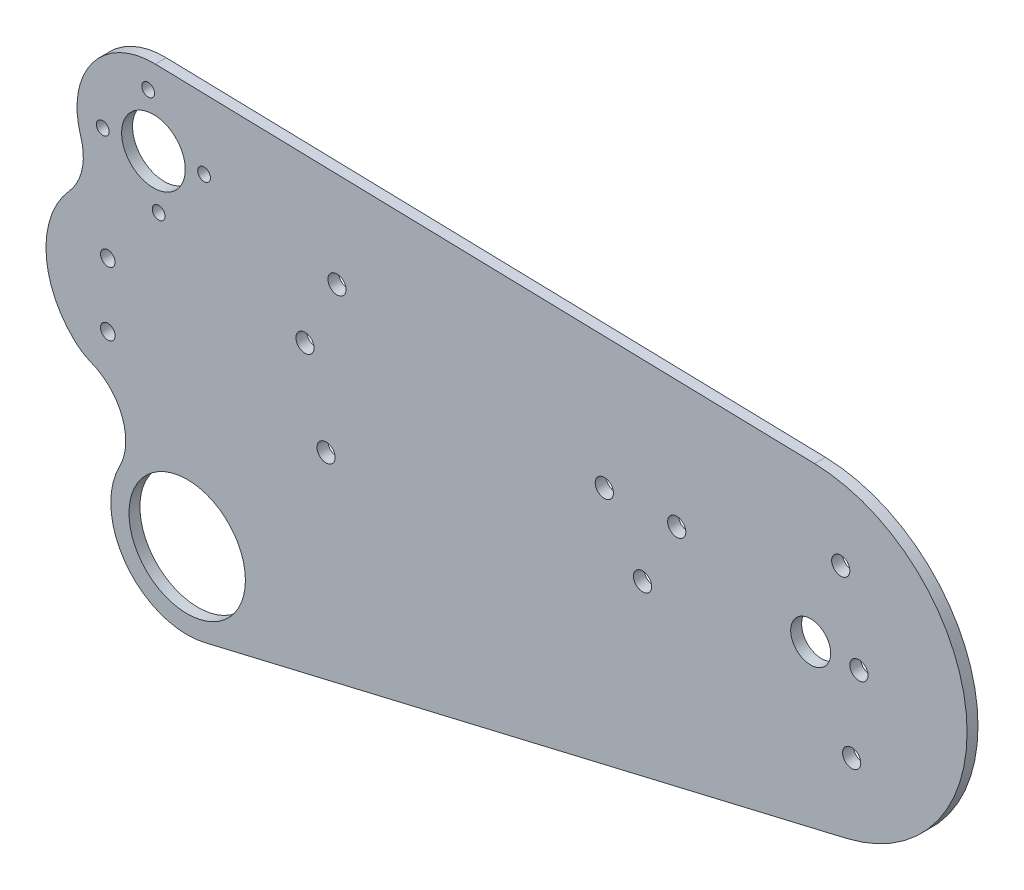
ISO-10303-21;
HEADER;
FILE_DESCRIPTION(('STEP AP214'),'2;1');
FILE_NAME('part.step','',(''),(''),'','','');
FILE_SCHEMA(('AUTOMOTIVE_DESIGN { 1 0 10303 214 1 1 1 1 }'));
ENDSEC;
DATA;
#1=APPLICATION_CONTEXT('core data for automotive mechanical design processes');
#2=APPLICATION_PROTOCOL_DEFINITION('international standard','automotive_design',2000,#1);
#3=PRODUCT_CONTEXT('',#1,'mechanical');
#4=PRODUCT('Part','Part','',(#3));
#5=PRODUCT_RELATED_PRODUCT_CATEGORY('part','',(#4));
#6=PRODUCT_DEFINITION_FORMATION('','',#4);
#7=PRODUCT_DEFINITION_CONTEXT('part definition',#1,'design');
#8=PRODUCT_DEFINITION('design','',#6,#7);
#9=PRODUCT_DEFINITION_SHAPE('','',#8);
#10=(LENGTH_UNIT() NAMED_UNIT(*) SI_UNIT(.MILLI.,.METRE.));
#11=(NAMED_UNIT(*) PLANE_ANGLE_UNIT() SI_UNIT($,.RADIAN.));
#12=(NAMED_UNIT(*) SI_UNIT($,.STERADIAN.) SOLID_ANGLE_UNIT());
#13=UNCERTAINTY_MEASURE_WITH_UNIT(LENGTH_MEASURE(1.E-05),#10,'distance_accuracy_value','');
#14=(GEOMETRIC_REPRESENTATION_CONTEXT(3) GLOBAL_UNCERTAINTY_ASSIGNED_CONTEXT((#13)) GLOBAL_UNIT_ASSIGNED_CONTEXT((#10,
#11,#12)) REPRESENTATION_CONTEXT('',''));
#15=CARTESIAN_POINT('',(0.,0.,0.));
#16=DIRECTION('',(0.,0.,1.));
#17=DIRECTION('',(1.,0.,0.));
#18=AXIS2_PLACEMENT_3D('',#15,#16,#17);
#19=CARTESIAN_POINT('',(64.9340765393794,0.,3.));
#20=DIRECTION('',(0.,0.,-1.));
#21=DIRECTION('',(-1.,0.,0.));
#22=AXIS2_PLACEMENT_3D('',#19,#20,#21);
#23=CYLINDRICAL_SURFACE('',#22,43.);
#24=CARTESIAN_POINT('',(64.9340765393794,0.,0.));
#25=DIRECTION('',(0.,0.,1.));
#26=DIRECTION('',(1.,0.,0.));
#27=AXIS2_PLACEMENT_3D('',#24,#25,#26);
#28=CIRCLE('',#27,43.);
#29=CARTESIAN_POINT('',(74.8022011227682,-41.8523609514053,0.));
#30=VERTEX_POINT('',#29);
#31=CARTESIAN_POINT('',(66.0029756588729,42.9867125362286,0.));
#32=VERTEX_POINT('',#31);
#33=EDGE_CURVE('E193',#30,#32,#28,.T.);
#34=ORIENTED_EDGE('',*,*,#33,.T.);
#35=DIRECTION('',(0.,0.,-1.));
#36=VECTOR('',#35,1.);
#37=CARTESIAN_POINT('',(66.0029756588729,42.9867125362286,3.));
#38=LINE('',#37,#36);
#39=CARTESIAN_POINT('',(66.0029756588729,42.9867125362286,3.));
#40=VERTEX_POINT('',#39);
#41=EDGE_CURVE('E11',#40,#32,#38,.T.);
#42=ORIENTED_EDGE('',*,*,#41,.F.);
#43=CARTESIAN_POINT('',(64.9340765393794,0.,3.));
#44=DIRECTION('',(0.,0.,1.));
#45=DIRECTION('',(1.,0.,0.));
#46=AXIS2_PLACEMENT_3D('',#43,#44,#45);
#47=CIRCLE('',#46,43.);
#48=CARTESIAN_POINT('',(74.8022011227682,-41.8523609514053,3.));
#49=VERTEX_POINT('',#48);
#50=EDGE_CURVE('E94',#49,#40,#47,.T.);
#51=ORIENTED_EDGE('',*,*,#50,.F.);
#52=DIRECTION('',(0.,0.,-1.));
#53=VECTOR('',#52,1.);
#54=CARTESIAN_POINT('',(74.8022011227682,-41.8523609514053,3.));
#55=LINE('',#54,#53);
#56=EDGE_CURVE('E177',#49,#30,#55,.T.);
#57=ORIENTED_EDGE('',*,*,#56,.T.);
#58=EDGE_LOOP('',(#34,#42,#51,#57));
#59=FACE_BOUND('',#58,.T.);
#60=ADVANCED_FACE('F35',(#59),#23,.T.);
#61=CARTESIAN_POINT('',(1.10902357906931,44.6003527554032,3.));
#62=DIRECTION('',(0.0248581190579893,0.999690989214617,0.));
#63=DIRECTION('',(-0.999690989214617,0.0248581190579893,0.));
#64=AXIS2_PLACEMENT_3D('',#61,#62,#63);
#65=PLANE('',#64);
#66=DIRECTION('',(0.999690989214617,-0.0248581190579893,0.));
#67=VECTOR('',#66,1.);
#68=CARTESIAN_POINT('',(1.10902357906931,44.6003527554032,0.));
#69=LINE('',#68,#67);
#70=CARTESIAN_POINT('',(-115.241855356107,47.4935107735069,0.));
#71=VERTEX_POINT('',#70);
#72=EDGE_CURVE('E196',#71,#32,#69,.T.);
#73=ORIENTED_EDGE('',*,*,#72,.F.);
#74=DIRECTION('',(0.,0.,-1.));
#75=VECTOR('',#74,1.);
#76=CARTESIAN_POINT('',(-115.241855356107,47.4935107735069,3.));
#77=LINE('',#76,#75);
#78=CARTESIAN_POINT('',(-115.241855356107,47.4935107735069,3.));
#79=VERTEX_POINT('',#78);
#80=EDGE_CURVE('E44',#79,#71,#77,.T.);
#81=ORIENTED_EDGE('',*,*,#80,.F.);
#82=DIRECTION('',(0.999690989214617,-0.0248581190579893,0.));
#83=VECTOR('',#82,1.);
#84=CARTESIAN_POINT('',(1.10902357906931,44.6003527554032,3.));
#85=LINE('',#84,#83);
#86=EDGE_CURVE('E278',#79,#40,#85,.T.);
#87=ORIENTED_EDGE('',*,*,#86,.T.);
#88=ORIENTED_EDGE('',*,*,#41,.T.);
#89=EDGE_LOOP('',(#73,#81,#87,#88));
#90=FACE_BOUND('',#89,.T.);
#91=ADVANCED_FACE('F277',(#90),#65,.T.);
#92=CARTESIAN_POINT('',(-115.763875856324,26.5,3.));
#93=DIRECTION('',(0.,0.,-1.));
#94=DIRECTION('',(-1.,0.,0.));
#95=AXIS2_PLACEMENT_3D('',#92,#93,#94);
#96=CYLINDRICAL_SURFACE('',#95,21.);
#97=CARTESIAN_POINT('',(-115.763875856324,26.5,0.));
#98=DIRECTION('',(0.,0.,1.));
#99=DIRECTION('',(1.,0.,0.));
#100=AXIS2_PLACEMENT_3D('',#97,#98,#99);
#101=CIRCLE('',#100,21.);
#102=CARTESIAN_POINT('',(-135.758964720812,20.0815561620252,0.));
#103=VERTEX_POINT('',#102);
#104=EDGE_CURVE('E199',#71,#103,#101,.T.);
#105=ORIENTED_EDGE('',*,*,#104,.T.);
#106=DIRECTION('',(0.,0.,-1.));
#107=VECTOR('',#106,1.);
#108=CARTESIAN_POINT('',(-135.758964720812,20.0815561620252,3.));
#109=LINE('',#108,#107);
#110=CARTESIAN_POINT('',(-135.758964720812,20.0815561620252,3.));
#111=VERTEX_POINT('',#110);
#112=EDGE_CURVE('E261',#111,#103,#109,.T.);
#113=ORIENTED_EDGE('',*,*,#112,.F.);
#114=CARTESIAN_POINT('',(-115.763875856324,26.5,3.));
#115=DIRECTION('',(0.,0.,1.));
#116=DIRECTION('',(1.,0.,0.));
#117=AXIS2_PLACEMENT_3D('',#114,#115,#116);
#118=CIRCLE('',#117,21.);
#119=EDGE_CURVE('E267',#79,#111,#118,.T.);
#120=ORIENTED_EDGE('',*,*,#119,.F.);
#121=ORIENTED_EDGE('',*,*,#80,.T.);
#122=EDGE_LOOP('',(#105,#113,#120,#121));
#123=FACE_BOUND('',#122,.T.);
#124=ADVANCED_FACE('F265',(#123),#96,.T.);
#125=CARTESIAN_POINT('',(-150.041171052589,15.4969534206147,3.));
#126=DIRECTION('',(0.,0.,-1.));
#127=DIRECTION('',(-1.,0.,0.));
#128=AXIS2_PLACEMENT_3D('',#125,#126,#127);
#129=CYLINDRICAL_SURFACE('',#128,15.);
#130=CARTESIAN_POINT('',(-150.041171052589,15.4969534206147,0.));
#131=DIRECTION('',(0.,0.,1.));
#132=DIRECTION('',(1.,0.,0.));
#133=AXIS2_PLACEMENT_3D('',#130,#131,#132);
#134=CIRCLE('',#133,15.);
#135=CARTESIAN_POINT('',(-138.890242706115,5.46416731645559,0.));
#136=VERTEX_POINT('',#135);
#137=EDGE_CURVE('E202',#136,#103,#134,.T.);
#138=ORIENTED_EDGE('',*,*,#137,.F.);
#139=DIRECTION('',(0.,0.,-1.));
#140=VECTOR('',#139,1.);
#141=CARTESIAN_POINT('',(-138.890242706115,5.46416731645559,3.));
#142=LINE('',#141,#140);
#143=CARTESIAN_POINT('',(-138.890242706115,5.46416731645559,3.));
#144=VERTEX_POINT('',#143);
#145=EDGE_CURVE('E259',#144,#136,#142,.T.);
#146=ORIENTED_EDGE('',*,*,#145,.F.);
#147=CARTESIAN_POINT('',(-150.041171052589,15.4969534206147,3.));
#148=DIRECTION('',(0.,0.,1.));
#149=DIRECTION('',(1.,0.,0.));
#150=AXIS2_PLACEMENT_3D('',#147,#148,#149);
#151=CIRCLE('',#150,15.);
#152=EDGE_CURVE('E291',#144,#111,#151,.T.);
#153=ORIENTED_EDGE('',*,*,#152,.T.);
#154=ORIENTED_EDGE('',*,*,#112,.T.);
#155=EDGE_LOOP('',(#138,#146,#153,#154));
#156=FACE_BOUND('',#155,.T.);
#157=ADVANCED_FACE('F290',(#156),#129,.F.);
#158=CARTESIAN_POINT('',(-120.305362128659,-11.2571428571429,3.));
#159=DIRECTION('',(0.,0.,-1.));
#160=DIRECTION('',(-1.,0.,0.));
#161=AXIS2_PLACEMENT_3D('',#158,#159,#160);
#162=CYLINDRICAL_SURFACE('',#161,25.);
#163=CARTESIAN_POINT('',(-120.305362128659,-11.2571428571429,0.));
#164=DIRECTION('',(0.,0.,1.));
#165=DIRECTION('',(1.,0.,0.));
#166=AXIS2_PLACEMENT_3D('',#163,#164,#165);
#167=CIRCLE('',#166,25.);
#168=CARTESIAN_POINT('',(-137.542861296201,-29.3642857142857,0.));
#169=VERTEX_POINT('',#168);
#170=EDGE_CURVE('E205',#136,#169,#167,.T.);
#171=ORIENTED_EDGE('',*,*,#170,.T.);
#172=DIRECTION('',(0.,0.,-1.));
#173=VECTOR('',#172,1.);
#174=CARTESIAN_POINT('',(-137.542861296201,-29.3642857142857,3.));
#175=LINE('',#174,#173);
#176=CARTESIAN_POINT('',(-137.542861296201,-29.3642857142857,3.));
#177=VERTEX_POINT('',#176);
#178=EDGE_CURVE('E256',#177,#169,#175,.T.);
#179=ORIENTED_EDGE('',*,*,#178,.F.);
#180=CARTESIAN_POINT('',(-120.305362128659,-11.2571428571429,3.));
#181=DIRECTION('',(0.,0.,1.));
#182=DIRECTION('',(1.,0.,0.));
#183=AXIS2_PLACEMENT_3D('',#180,#181,#182);
#184=CIRCLE('',#183,25.);
#185=EDGE_CURVE('E133',#144,#177,#184,.T.);
#186=ORIENTED_EDGE('',*,*,#185,.F.);
#187=ORIENTED_EDGE('',*,*,#145,.T.);
#188=EDGE_LOOP('',(#171,#179,#186,#187));
#189=FACE_BOUND('',#188,.T.);
#190=ADVANCED_FACE('F286',(#189),#162,.T.);
#191=CARTESIAN_POINT('',(-127.200361795676,-18.5,3.));
#192=DIRECTION('',(0.,0.,-1.));
#193=DIRECTION('',(-1.,0.,0.));
#194=AXIS2_PLACEMENT_3D('',#191,#192,#193);
#195=CYLINDRICAL_SURFACE('',#194,15.);
#196=CARTESIAN_POINT('',(-127.200361795676,-18.5,0.));
#197=DIRECTION('',(0.,0.,1.));
#198=DIRECTION('',(1.,0.,0.));
#199=AXIS2_PLACEMENT_3D('',#196,#197,#198);
#200=CIRCLE('',#199,15.);
#201=CARTESIAN_POINT('',(-132.790777729319,-32.4193121126322,0.));
#202=VERTEX_POINT('',#201);
#203=EDGE_CURVE('E207',#169,#202,#200,.T.);
#204=ORIENTED_EDGE('',*,*,#203,.T.);
#205=DIRECTION('',(0.,0.,-1.));
#206=VECTOR('',#205,1.);
#207=CARTESIAN_POINT('',(-132.790777729319,-32.4193121126322,3.));
#208=LINE('',#207,#206);
#209=CARTESIAN_POINT('',(-132.790777729319,-32.4193121126322,3.));
#210=VERTEX_POINT('',#209);
#211=EDGE_CURVE('E121',#210,#202,#208,.T.);
#212=ORIENTED_EDGE('',*,*,#211,.F.);
#213=CARTESIAN_POINT('',(-127.200361795676,-18.5,3.));
#214=DIRECTION('',(0.,0.,1.));
#215=DIRECTION('',(1.,0.,0.));
#216=AXIS2_PLACEMENT_3D('',#213,#214,#215);
#217=CIRCLE('',#216,15.);
#218=EDGE_CURVE('E130',#177,#210,#217,.T.);
#219=ORIENTED_EDGE('',*,*,#218,.F.);
#220=ORIENTED_EDGE('',*,*,#178,.T.);
#221=EDGE_LOOP('',(#204,#212,#219,#220));
#222=FACE_BOUND('',#221,.T.);
#223=ADVANCED_FACE('F282',(#222),#195,.T.);
#224=CARTESIAN_POINT('',(-138.381193662962,-46.3386242252644,3.));
#225=DIRECTION('',(0.,0.,-1.));
#226=DIRECTION('',(-1.,0.,0.));
#227=AXIS2_PLACEMENT_3D('',#224,#225,#226);
#228=CYLINDRICAL_SURFACE('',#227,15.);
#229=CARTESIAN_POINT('',(-138.381193662962,-46.3386242252644,0.));
#230=DIRECTION('',(0.,0.,1.));
#231=DIRECTION('',(1.,0.,0.));
#232=AXIS2_PLACEMENT_3D('',#229,#230,#231);
#233=CIRCLE('',#232,15.);
#234=CARTESIAN_POINT('',(-125.08868844963,-53.289113787412,0.));
#235=VERTEX_POINT('',#234);
#236=EDGE_CURVE('E120',#235,#202,#233,.T.);
#237=ORIENTED_EDGE('',*,*,#236,.F.);
#238=DIRECTION('',(0.,0.,-1.));
#239=VECTOR('',#238,1.);
#240=CARTESIAN_POINT('',(-125.08868844963,-53.289113787412,3.));
#241=LINE('',#240,#239);
#242=CARTESIAN_POINT('',(-125.08868844963,-53.289113787412,3.));
#243=VERTEX_POINT('',#242);
#244=EDGE_CURVE('E114',#243,#235,#241,.T.);
#245=ORIENTED_EDGE('',*,*,#244,.F.);
#246=CARTESIAN_POINT('',(-138.381193662962,-46.3386242252644,3.));
#247=DIRECTION('',(0.,0.,1.));
#248=DIRECTION('',(1.,0.,0.));
#249=AXIS2_PLACEMENT_3D('',#246,#247,#248);
#250=CIRCLE('',#249,15.);
#251=EDGE_CURVE('E118',#243,#210,#250,.T.);
#252=ORIENTED_EDGE('',*,*,#251,.T.);
#253=ORIENTED_EDGE('',*,*,#211,.T.);
#254=EDGE_LOOP('',(#237,#245,#252,#253));
#255=FACE_BOUND('',#254,.T.);
#256=ADVANCED_FACE('F116',(#255),#228,.F.);
#257=CARTESIAN_POINT('',(-106.479181150964,-63.0197991744187,3.));
#258=DIRECTION('',(0.,0.,-1.));
#259=DIRECTION('',(-1.,0.,0.));
#260=AXIS2_PLACEMENT_3D('',#257,#258,#259);
#261=CYLINDRICAL_SURFACE('',#260,21.);
#262=CARTESIAN_POINT('',(-106.479181150964,-63.0197991744187,0.));
#263=DIRECTION('',(0.,0.,1.));
#264=DIRECTION('',(1.,0.,0.));
#265=AXIS2_PLACEMENT_3D('',#262,#263,#264);
#266=CIRCLE('',#265,21.);
#267=CARTESIAN_POINT('',(-101.65986449396,-83.4593242902213,0.));
#268=VERTEX_POINT('',#267);
#269=EDGE_CURVE('E82',#235,#268,#266,.T.);
#270=ORIENTED_EDGE('',*,*,#269,.T.);
#271=DIRECTION('',(0.,0.,-1.));
#272=VECTOR('',#271,1.);
#273=CARTESIAN_POINT('',(-101.65986449396,-83.4593242902213,3.));
#274=LINE('',#273,#272);
#275=CARTESIAN_POINT('',(-101.65986449396,-83.4593242902213,3.));
#276=VERTEX_POINT('',#275);
#277=EDGE_CURVE('E122',#276,#268,#274,.T.);
#278=ORIENTED_EDGE('',*,*,#277,.F.);
#279=CARTESIAN_POINT('',(-106.479181150964,-63.0197991744187,3.));
#280=DIRECTION('',(0.,0.,1.));
#281=DIRECTION('',(1.,0.,0.));
#282=AXIS2_PLACEMENT_3D('',#279,#280,#281);
#283=CIRCLE('',#282,21.);
#284=EDGE_CURVE('E124',#243,#276,#283,.T.);
#285=ORIENTED_EDGE('',*,*,#284,.F.);
#286=ORIENTED_EDGE('',*,*,#244,.T.);
#287=EDGE_LOOP('',(#270,#278,#285,#286));
#288=FACE_BOUND('',#287,.T.);
#289=ADVANCED_FACE('F125',(#288),#261,.T.);
#290=CARTESIAN_POINT('',(-101.838573762526,27.9442858430561,3.));
#291=DIRECTION('',(0.,0.,-1.));
#292=DIRECTION('',(-1.,0.,0.));
#293=AXIS2_PLACEMENT_3D('',#290,#291,#292);
#294=CYLINDRICAL_SURFACE('',#293,1.74999999999997);
#295=CARTESIAN_POINT('',(-101.838573762526,27.9442858430561,3.));
#296=DIRECTION('',(0.,0.,1.));
#297=DIRECTION('',(1.,0.,0.));
#298=AXIS2_PLACEMENT_3D('',#295,#296,#297);
#299=CIRCLE('',#298,1.74999999999997);
#300=CARTESIAN_POINT('',(-100.088573762526,27.9442858430561,3.));
#301=VERTEX_POINT('',#300);
#302=EDGE_CURVE('E171',#301,#301,#299,.T.);
#303=ORIENTED_EDGE('',*,*,#302,.T.);
#304=EDGE_LOOP('',(#303));
#305=FACE_BOUND('',#304,.T.);
#306=CARTESIAN_POINT('',(-101.838573762526,27.9442858430561,0.));
#307=DIRECTION('',(0.,0.,1.));
#308=DIRECTION('',(1.,0.,0.));
#309=AXIS2_PLACEMENT_3D('',#306,#307,#308);
#310=CIRCLE('',#309,1.74999999999997);
#311=CARTESIAN_POINT('',(-100.088573762526,27.9442858430561,0.));
#312=VERTEX_POINT('',#311);
#313=EDGE_CURVE('E246',#312,#312,#310,.T.);
#314=ORIENTED_EDGE('',*,*,#313,.F.);
#315=EDGE_LOOP('',(#314));
#316=FACE_BOUND('',#315,.T.);
#317=ADVANCED_FACE('F377',(#305,#316),#294,.F.);
#318=CARTESIAN_POINT('',(-114.319590013268,12.5746979062015,3.));
#319=DIRECTION('',(0.,0.,-1.));
#320=DIRECTION('',(-1.,0.,0.));
#321=AXIS2_PLACEMENT_3D('',#318,#319,#320);
#322=CYLINDRICAL_SURFACE('',#321,1.74999999999997);
#323=CARTESIAN_POINT('',(-114.319590013268,12.5746979062015,3.));
#324=DIRECTION('',(0.,0.,1.));
#325=DIRECTION('',(1.,0.,0.));
#326=AXIS2_PLACEMENT_3D('',#323,#324,#325);
#327=CIRCLE('',#326,1.74999999999997);
#328=CARTESIAN_POINT('',(-112.569590013268,12.5746979062015,3.));
#329=VERTEX_POINT('',#328);
#330=EDGE_CURVE('E168',#329,#329,#327,.T.);
#331=ORIENTED_EDGE('',*,*,#330,.T.);
#332=EDGE_LOOP('',(#331));
#333=FACE_BOUND('',#332,.T.);
#334=CARTESIAN_POINT('',(-114.319590013268,12.5746979062015,0.));
#335=DIRECTION('',(0.,0.,1.));
#336=DIRECTION('',(1.,0.,0.));
#337=AXIS2_PLACEMENT_3D('',#334,#335,#336);
#338=CIRCLE('',#337,1.74999999999997);
#339=CARTESIAN_POINT('',(-112.569590013268,12.5746979062015,0.));
#340=VERTEX_POINT('',#339);
#341=EDGE_CURVE('E243',#340,#340,#338,.T.);
#342=ORIENTED_EDGE('',*,*,#341,.F.);
#343=EDGE_LOOP('',(#342));
#344=FACE_BOUND('',#343,.T.);
#345=ADVANCED_FACE('F380',(#333,#344),#322,.F.);
#346=CARTESIAN_POINT('',(-129.689177950123,25.0557141569439,3.));
#347=DIRECTION('',(0.,0.,-1.));
#348=DIRECTION('',(-1.,0.,0.));
#349=AXIS2_PLACEMENT_3D('',#346,#347,#348);
#350=CYLINDRICAL_SURFACE('',#349,1.74999999999998);
#351=CARTESIAN_POINT('',(-129.689177950123,25.0557141569439,3.));
#352=DIRECTION('',(0.,0.,1.));
#353=DIRECTION('',(1.,0.,0.));
#354=AXIS2_PLACEMENT_3D('',#351,#352,#353);
#355=CIRCLE('',#354,1.74999999999998);
#356=CARTESIAN_POINT('',(-127.939177950123,25.0557141569439,3.));
#357=VERTEX_POINT('',#356);
#358=EDGE_CURVE('E165',#357,#357,#355,.T.);
#359=ORIENTED_EDGE('',*,*,#358,.T.);
#360=EDGE_LOOP('',(#359));
#361=FACE_BOUND('',#360,.T.);
#362=CARTESIAN_POINT('',(-129.689177950123,25.0557141569439,0.));
#363=DIRECTION('',(0.,0.,1.));
#364=DIRECTION('',(1.,0.,0.));
#365=AXIS2_PLACEMENT_3D('',#362,#363,#364);
#366=CIRCLE('',#365,1.74999999999998);
#367=CARTESIAN_POINT('',(-127.939177950123,25.0557141569439,0.));
#368=VERTEX_POINT('',#367);
#369=EDGE_CURVE('E240',#368,#368,#366,.T.);
#370=ORIENTED_EDGE('',*,*,#369,.F.);
#371=EDGE_LOOP('',(#370));
#372=FACE_BOUND('',#371,.T.);
#373=ADVANCED_FACE('F384',(#361,#372),#350,.F.);
#374=CARTESIAN_POINT('',(-115.763875856324,26.5,3.));
#375=DIRECTION('',(0.,0.,-1.));
#376=DIRECTION('',(-1.,0.,0.));
#377=AXIS2_PLACEMENT_3D('',#374,#375,#376);
#378=CYLINDRICAL_SURFACE('',#377,8.75);
#379=CARTESIAN_POINT('',(-115.763875856324,26.5,3.));
#380=DIRECTION('',(0.,0.,1.));
#381=DIRECTION('',(1.,0.,0.));
#382=AXIS2_PLACEMENT_3D('',#379,#380,#381);
#383=CIRCLE('',#382,8.75);
#384=CARTESIAN_POINT('',(-107.013875856324,26.5,3.));
#385=VERTEX_POINT('',#384);
#386=EDGE_CURVE('E162',#385,#385,#383,.T.);
#387=ORIENTED_EDGE('',*,*,#386,.T.);
#388=EDGE_LOOP('',(#387));
#389=FACE_BOUND('',#388,.T.);
#390=CARTESIAN_POINT('',(-115.763875856324,26.5,0.));
#391=DIRECTION('',(0.,0.,1.));
#392=DIRECTION('',(1.,0.,0.));
#393=AXIS2_PLACEMENT_3D('',#390,#391,#392);
#394=CIRCLE('',#393,8.75);
#395=CARTESIAN_POINT('',(-107.013875856324,26.5,0.));
#396=VERTEX_POINT('',#395);
#397=EDGE_CURVE('E237',#396,#396,#394,.T.);
#398=ORIENTED_EDGE('',*,*,#397,.F.);
#399=EDGE_LOOP('',(#398));
#400=FACE_BOUND('',#399,.T.);
#401=ADVANCED_FACE('F388',(#389,#400),#378,.F.);
#402=CARTESIAN_POINT('',(-106.479181150964,-63.0197991744187,3.));
#403=DIRECTION('',(0.,0.,-1.));
#404=DIRECTION('',(-1.,0.,0.));
#405=AXIS2_PLACEMENT_3D('',#402,#403,#404);
#406=CYLINDRICAL_SURFACE('',#405,16.);
#407=CARTESIAN_POINT('',(-106.479181150964,-63.0197991744187,3.));
#408=DIRECTION('',(0.,0.,1.));
#409=DIRECTION('',(1.,0.,0.));
#410=AXIS2_PLACEMENT_3D('',#407,#408,#409);
#411=CIRCLE('',#410,16.);
#412=CARTESIAN_POINT('',(-90.4791811509637,-63.0197991744187,3.));
#413=VERTEX_POINT('',#412);
#414=EDGE_CURVE('E159',#413,#413,#411,.T.);
#415=ORIENTED_EDGE('',*,*,#414,.T.);
#416=EDGE_LOOP('',(#415));
#417=FACE_BOUND('',#416,.T.);
#418=CARTESIAN_POINT('',(-106.479181150964,-63.0197991744187,0.));
#419=DIRECTION('',(0.,0.,1.));
#420=DIRECTION('',(1.,0.,0.));
#421=AXIS2_PLACEMENT_3D('',#418,#419,#420);
#422=CIRCLE('',#421,16.);
#423=CARTESIAN_POINT('',(-90.4791811509637,-63.0197991744187,0.));
#424=VERTEX_POINT('',#423);
#425=EDGE_CURVE('E234',#424,#424,#422,.T.);
#426=ORIENTED_EDGE('',*,*,#425,.F.);
#427=EDGE_LOOP('',(#426));
#428=FACE_BOUND('',#427,.T.);
#429=ADVANCED_FACE('F392',(#417,#428),#406,.F.);
#430=CARTESIAN_POINT('',(-68.3,-21.5,3.));
#431=DIRECTION('',(0.,0.,-1.));
#432=DIRECTION('',(-1.,0.,0.));
#433=AXIS2_PLACEMENT_3D('',#430,#431,#432);
#434=CYLINDRICAL_SURFACE('',#433,2.49999999999999);
#435=CARTESIAN_POINT('',(-68.3,-21.5,3.));
#436=DIRECTION('',(0.,0.,1.));
#437=DIRECTION('',(1.,0.,0.));
#438=AXIS2_PLACEMENT_3D('',#435,#436,#437);
#439=CIRCLE('',#438,2.49999999999999);
#440=CARTESIAN_POINT('',(-65.8,-21.5,3.));
#441=VERTEX_POINT('',#440);
#442=EDGE_CURVE('E156',#441,#441,#439,.T.);
#443=ORIENTED_EDGE('',*,*,#442,.T.);
#444=EDGE_LOOP('',(#443));
#445=FACE_BOUND('',#444,.T.);
#446=CARTESIAN_POINT('',(-68.3,-21.5,0.));
#447=DIRECTION('',(0.,0.,1.));
#448=DIRECTION('',(1.,0.,0.));
#449=AXIS2_PLACEMENT_3D('',#446,#447,#448);
#450=CIRCLE('',#449,2.49999999999999);
#451=CARTESIAN_POINT('',(-65.8,-21.5,0.));
#452=VERTEX_POINT('',#451);
#453=EDGE_CURVE('E231',#452,#452,#450,.T.);
#454=ORIENTED_EDGE('',*,*,#453,.F.);
#455=EDGE_LOOP('',(#454));
#456=FACE_BOUND('',#455,.T.);
#457=ADVANCED_FACE('F396',(#445,#456),#434,.F.);
#458=CARTESIAN_POINT('',(-128.3,-5.25000000000004,3.));
#459=DIRECTION('',(0.,0.,-1.));
#460=DIRECTION('',(-1.,0.,0.));
#461=AXIS2_PLACEMENT_3D('',#458,#459,#460);
#462=CYLINDRICAL_SURFACE('',#461,2.);
#463=CARTESIAN_POINT('',(-128.3,-5.25000000000004,3.));
#464=DIRECTION('',(0.,0.,1.));
#465=DIRECTION('',(1.,0.,0.));
#466=AXIS2_PLACEMENT_3D('',#463,#464,#465);
#467=CIRCLE('',#466,2.);
#468=CARTESIAN_POINT('',(-126.3,-5.25000000000004,3.));
#469=VERTEX_POINT('',#468);
#470=EDGE_CURVE('E153',#469,#469,#467,.T.);
#471=ORIENTED_EDGE('',*,*,#470,.T.);
#472=EDGE_LOOP('',(#471));
#473=FACE_BOUND('',#472,.T.);
#474=CARTESIAN_POINT('',(-128.3,-5.25000000000004,0.));
#475=DIRECTION('',(0.,0.,1.));
#476=DIRECTION('',(1.,0.,0.));
#477=AXIS2_PLACEMENT_3D('',#474,#475,#476);
#478=CIRCLE('',#477,2.);
#479=CARTESIAN_POINT('',(-126.3,-5.25000000000004,0.));
#480=VERTEX_POINT('',#479);
#481=EDGE_CURVE('E228',#480,#480,#478,.T.);
#482=ORIENTED_EDGE('',*,*,#481,.F.);
#483=EDGE_LOOP('',(#482));
#484=FACE_BOUND('',#483,.T.);
#485=ADVANCED_FACE('F400',(#473,#484),#462,.F.);
#486=CARTESIAN_POINT('',(-128.3,-22.75,3.));
#487=DIRECTION('',(0.,0.,-1.));
#488=DIRECTION('',(-1.,0.,0.));
#489=AXIS2_PLACEMENT_3D('',#486,#487,#488);
#490=CYLINDRICAL_SURFACE('',#489,2.);
#491=CARTESIAN_POINT('',(-128.3,-22.75,3.));
#492=DIRECTION('',(0.,0.,1.));
#493=DIRECTION('',(1.,0.,0.));
#494=AXIS2_PLACEMENT_3D('',#491,#492,#493);
#495=CIRCLE('',#494,2.);
#496=CARTESIAN_POINT('',(-126.3,-22.75,3.));
#497=VERTEX_POINT('',#496);
#498=EDGE_CURVE('E150',#497,#497,#495,.T.);
#499=ORIENTED_EDGE('',*,*,#498,.T.);
#500=EDGE_LOOP('',(#499));
#501=FACE_BOUND('',#500,.T.);
#502=CARTESIAN_POINT('',(-128.3,-22.75,0.));
#503=DIRECTION('',(0.,0.,1.));
#504=DIRECTION('',(1.,0.,0.));
#505=AXIS2_PLACEMENT_3D('',#502,#503,#504);
#506=CIRCLE('',#505,2.);
#507=CARTESIAN_POINT('',(-126.3,-22.75,0.));
#508=VERTEX_POINT('',#507);
#509=EDGE_CURVE('E225',#508,#508,#506,.T.);
#510=ORIENTED_EDGE('',*,*,#509,.F.);
#511=EDGE_LOOP('',(#510));
#512=FACE_BOUND('',#511,.T.);
#513=ADVANCED_FACE('F404',(#501,#512),#490,.F.);
#514=CARTESIAN_POINT('',(-74.1,1.7,3.));
#515=DIRECTION('',(0.,0.,-1.));
#516=DIRECTION('',(-1.,0.,0.));
#517=AXIS2_PLACEMENT_3D('',#514,#515,#516);
#518=CYLINDRICAL_SURFACE('',#517,2.49999999999999);
#519=CARTESIAN_POINT('',(-74.1,1.7,3.));
#520=DIRECTION('',(0.,0.,1.));
#521=DIRECTION('',(1.,0.,0.));
#522=AXIS2_PLACEMENT_3D('',#519,#520,#521);
#523=CIRCLE('',#522,2.49999999999999);
#524=CARTESIAN_POINT('',(-71.6,1.7,3.));
#525=VERTEX_POINT('',#524);
#526=EDGE_CURVE('E147',#525,#525,#523,.T.);
#527=ORIENTED_EDGE('',*,*,#526,.T.);
#528=EDGE_LOOP('',(#527));
#529=FACE_BOUND('',#528,.T.);
#530=CARTESIAN_POINT('',(-74.1,1.7,0.));
#531=DIRECTION('',(0.,0.,1.));
#532=DIRECTION('',(1.,0.,0.));
#533=AXIS2_PLACEMENT_3D('',#530,#531,#532);
#534=CIRCLE('',#533,2.49999999999999);
#535=CARTESIAN_POINT('',(-71.6,1.7,0.));
#536=VERTEX_POINT('',#535);
#537=EDGE_CURVE('E222',#536,#536,#534,.T.);
#538=ORIENTED_EDGE('',*,*,#537,.F.);
#539=EDGE_LOOP('',(#538));
#540=FACE_BOUND('',#539,.T.);
#541=ADVANCED_FACE('F408',(#529,#540),#518,.F.);
#542=CARTESIAN_POINT('',(-65.3,20.,3.));
#543=DIRECTION('',(0.,0.,-1.));
#544=DIRECTION('',(-1.,0.,0.));
#545=AXIS2_PLACEMENT_3D('',#542,#543,#544);
#546=CYLINDRICAL_SURFACE('',#545,2.50000000000001);
#547=CARTESIAN_POINT('',(-65.3,20.,3.));
#548=DIRECTION('',(0.,0.,1.));
#549=DIRECTION('',(1.,0.,0.));
#550=AXIS2_PLACEMENT_3D('',#547,#548,#549);
#551=CIRCLE('',#550,2.50000000000001);
#552=CARTESIAN_POINT('',(-62.8,20.,3.));
#553=VERTEX_POINT('',#552);
#554=EDGE_CURVE('E144',#553,#553,#551,.T.);
#555=ORIENTED_EDGE('',*,*,#554,.T.);
#556=EDGE_LOOP('',(#555));
#557=FACE_BOUND('',#556,.T.);
#558=CARTESIAN_POINT('',(-65.3,20.,0.));
#559=DIRECTION('',(0.,0.,1.));
#560=DIRECTION('',(1.,0.,0.));
#561=AXIS2_PLACEMENT_3D('',#558,#559,#560);
#562=CIRCLE('',#561,2.50000000000001);
#563=CARTESIAN_POINT('',(-62.8,20.,0.));
#564=VERTEX_POINT('',#563);
#565=EDGE_CURVE('E219',#564,#564,#562,.T.);
#566=ORIENTED_EDGE('',*,*,#565,.F.);
#567=EDGE_LOOP('',(#566));
#568=FACE_BOUND('',#567,.T.);
#569=ADVANCED_FACE('F412',(#557,#568),#546,.F.);
#570=CARTESIAN_POINT('',(8.20000000000003,8.3,3.));
#571=DIRECTION('',(0.,0.,-1.));
#572=DIRECTION('',(-1.,0.,0.));
#573=AXIS2_PLACEMENT_3D('',#570,#571,#572);
#574=CYLINDRICAL_SURFACE('',#573,2.5);
#575=CARTESIAN_POINT('',(8.20000000000003,8.3,3.));
#576=DIRECTION('',(0.,0.,1.));
#577=DIRECTION('',(1.,0.,0.));
#578=AXIS2_PLACEMENT_3D('',#575,#576,#577);
#579=CIRCLE('',#578,2.5);
#580=CARTESIAN_POINT('',(10.7,8.3,3.));
#581=VERTEX_POINT('',#580);
#582=EDGE_CURVE('E141',#581,#581,#579,.T.);
#583=ORIENTED_EDGE('',*,*,#582,.T.);
#584=EDGE_LOOP('',(#583));
#585=FACE_BOUND('',#584,.T.);
#586=CARTESIAN_POINT('',(8.20000000000003,8.3,0.));
#587=DIRECTION('',(0.,0.,1.));
#588=DIRECTION('',(1.,0.,0.));
#589=AXIS2_PLACEMENT_3D('',#586,#587,#588);
#590=CIRCLE('',#589,2.5);
#591=CARTESIAN_POINT('',(10.7,8.3,0.));
#592=VERTEX_POINT('',#591);
#593=EDGE_CURVE('E216',#592,#592,#590,.T.);
#594=ORIENTED_EDGE('',*,*,#593,.F.);
#595=EDGE_LOOP('',(#594));
#596=FACE_BOUND('',#595,.T.);
#597=ADVANCED_FACE('F416',(#585,#596),#574,.F.);
#598=CARTESIAN_POINT('',(18.7,-8.7,3.));
#599=DIRECTION('',(0.,0.,-1.));
#600=DIRECTION('',(-1.,0.,0.));
#601=AXIS2_PLACEMENT_3D('',#598,#599,#600);
#602=CYLINDRICAL_SURFACE('',#601,2.5);
#603=CARTESIAN_POINT('',(18.7,-8.7,3.));
#604=DIRECTION('',(0.,0.,1.));
#605=DIRECTION('',(1.,0.,0.));
#606=AXIS2_PLACEMENT_3D('',#603,#604,#605);
#607=CIRCLE('',#606,2.5);
#608=CARTESIAN_POINT('',(21.2,-8.7,3.));
#609=VERTEX_POINT('',#608);
#610=EDGE_CURVE('E138',#609,#609,#607,.T.);
#611=ORIENTED_EDGE('',*,*,#610,.T.);
#612=EDGE_LOOP('',(#611));
#613=FACE_BOUND('',#612,.T.);
#614=CARTESIAN_POINT('',(18.7,-8.7,0.));
#615=DIRECTION('',(0.,0.,1.));
#616=DIRECTION('',(1.,0.,0.));
#617=AXIS2_PLACEMENT_3D('',#614,#615,#616);
#618=CIRCLE('',#617,2.5);
#619=CARTESIAN_POINT('',(21.2,-8.7,0.));
#620=VERTEX_POINT('',#619);
#621=EDGE_CURVE('E213',#620,#620,#618,.T.);
#622=ORIENTED_EDGE('',*,*,#621,.F.);
#623=EDGE_LOOP('',(#622));
#624=FACE_BOUND('',#623,.T.);
#625=ADVANCED_FACE('F420',(#613,#624),#602,.F.);
#626=CARTESIAN_POINT('',(13.2879584193515,-56.3564461893912,3.));
#627=DIRECTION('',(-0.229491269381136,0.973310719800124,0.));
#628=DIRECTION('',(-0.973310719800124,-0.229491269381136,0.));
#629=AXIS2_PLACEMENT_3D('',#626,#627,#628);
#630=PLANE('',#629);
#631=DIRECTION('',(0.973310719800124,0.229491269381137,0.));
#632=VECTOR('',#631,1.);
#633=CARTESIAN_POINT('',(13.2879584193515,-56.3564461893912,0.));
#634=LINE('',#633,#632);
#635=EDGE_CURVE('E88',#268,#30,#634,.T.);
#636=ORIENTED_EDGE('',*,*,#635,.T.);
#637=ORIENTED_EDGE('',*,*,#56,.F.);
#638=DIRECTION('',(0.973310719800124,0.229491269381137,0.));
#639=VECTOR('',#638,1.);
#640=CARTESIAN_POINT('',(13.2879584193515,-56.3564461893912,3.));
#641=LINE('',#640,#639);
#642=EDGE_CURVE('E52',#276,#49,#641,.T.);
#643=ORIENTED_EDGE('',*,*,#642,.F.);
#644=ORIENTED_EDGE('',*,*,#277,.T.);
#645=EDGE_LOOP('',(#636,#637,#643,#644));
#646=FACE_BOUND('',#645,.T.);
#647=ADVANCED_FACE('F330',(#646),#630,.F.);
#648=CARTESIAN_POINT('',(73.2,22.3,3.));
#649=DIRECTION('',(0.,0.,-1.));
#650=DIRECTION('',(-1.,0.,0.));
#651=AXIS2_PLACEMENT_3D('',#648,#649,#650);
#652=CYLINDRICAL_SURFACE('',#651,2.50000000000001);
#653=CARTESIAN_POINT('',(73.2,22.3,3.));
#654=DIRECTION('',(0.,0.,1.));
#655=DIRECTION('',(1.,0.,0.));
#656=AXIS2_PLACEMENT_3D('',#653,#654,#655);
#657=CIRCLE('',#656,2.50000000000001);
#658=CARTESIAN_POINT('',(75.7000000000001,22.3,3.));
#659=VERTEX_POINT('',#658);
#660=EDGE_CURVE('E297',#659,#659,#657,.T.);
#661=ORIENTED_EDGE('',*,*,#660,.T.);
#662=EDGE_LOOP('',(#661));
#663=FACE_BOUND('',#662,.T.);
#664=CARTESIAN_POINT('',(73.2,22.3,0.));
#665=DIRECTION('',(0.,0.,1.));
#666=DIRECTION('',(1.,0.,0.));
#667=AXIS2_PLACEMENT_3D('',#664,#665,#666);
#668=CIRCLE('',#667,2.50000000000001);
#669=CARTESIAN_POINT('',(75.7000000000001,22.3,0.));
#670=VERTEX_POINT('',#669);
#671=EDGE_CURVE('E190',#670,#670,#668,.T.);
#672=ORIENTED_EDGE('',*,*,#671,.F.);
#673=EDGE_LOOP('',(#672));
#674=FACE_BOUND('',#673,.T.);
#675=ADVANCED_FACE('F326',(#663,#674),#652,.F.);
#676=CARTESIAN_POINT('',(76.2,-22.,3.));
#677=DIRECTION('',(0.,0.,-1.));
#678=DIRECTION('',(-1.,0.,0.));
#679=AXIS2_PLACEMENT_3D('',#676,#677,#678);
#680=CYLINDRICAL_SURFACE('',#679,2.5);
#681=CARTESIAN_POINT('',(76.2,-22.,3.));
#682=DIRECTION('',(0.,0.,1.));
#683=DIRECTION('',(1.,0.,0.));
#684=AXIS2_PLACEMENT_3D('',#681,#682,#683);
#685=CIRCLE('',#684,2.5);
#686=CARTESIAN_POINT('',(78.7,-22.,3.));
#687=VERTEX_POINT('',#686);
#688=EDGE_CURVE('E300',#687,#687,#685,.T.);
#689=ORIENTED_EDGE('',*,*,#688,.T.);
#690=EDGE_LOOP('',(#689));
#691=FACE_BOUND('',#690,.T.);
#692=CARTESIAN_POINT('',(76.2,-22.,0.));
#693=DIRECTION('',(0.,0.,1.));
#694=DIRECTION('',(1.,0.,0.));
#695=AXIS2_PLACEMENT_3D('',#692,#693,#694);
#696=CIRCLE('',#695,2.5);
#697=CARTESIAN_POINT('',(78.7,-22.,0.));
#698=VERTEX_POINT('',#697);
#699=EDGE_CURVE('E187',#698,#698,#696,.T.);
#700=ORIENTED_EDGE('',*,*,#699,.F.);
#701=EDGE_LOOP('',(#700));
#702=FACE_BOUND('',#701,.T.);
#703=ADVANCED_FACE('F329',(#691,#702),#680,.F.);
#704=CARTESIAN_POINT('',(78.2,-0.100000000000003,3.));
#705=DIRECTION('',(0.,0.,-1.));
#706=DIRECTION('',(-1.,0.,0.));
#707=AXIS2_PLACEMENT_3D('',#704,#705,#706);
#708=CYLINDRICAL_SURFACE('',#707,2.5);
#709=CARTESIAN_POINT('',(78.2,-0.100000000000003,3.));
#710=DIRECTION('',(0.,0.,1.));
#711=DIRECTION('',(1.,0.,0.));
#712=AXIS2_PLACEMENT_3D('',#709,#710,#711);
#713=CIRCLE('',#712,2.5);
#714=CARTESIAN_POINT('',(80.7,-0.100000000000003,3.));
#715=VERTEX_POINT('',#714);
#716=EDGE_CURVE('E303',#715,#715,#713,.T.);
#717=ORIENTED_EDGE('',*,*,#716,.T.);
#718=EDGE_LOOP('',(#717));
#719=FACE_BOUND('',#718,.T.);
#720=CARTESIAN_POINT('',(78.2,-0.100000000000003,0.));
#721=DIRECTION('',(0.,0.,1.));
#722=DIRECTION('',(1.,0.,0.));
#723=AXIS2_PLACEMENT_3D('',#720,#721,#722);
#724=CIRCLE('',#723,2.5);
#725=CARTESIAN_POINT('',(80.7,-0.100000000000003,0.));
#726=VERTEX_POINT('',#725);
#727=EDGE_CURVE('E184',#726,#726,#724,.T.);
#728=ORIENTED_EDGE('',*,*,#727,.F.);
#729=EDGE_LOOP('',(#728));
#730=FACE_BOUND('',#729,.T.);
#731=ADVANCED_FACE('F351',(#719,#730),#708,.F.);
#732=CARTESIAN_POINT('',(28.1,9.,3.));
#733=DIRECTION('',(0.,0.,-1.));
#734=DIRECTION('',(-1.,0.,0.));
#735=AXIS2_PLACEMENT_3D('',#732,#733,#734);
#736=CYLINDRICAL_SURFACE('',#735,2.5);
#737=CARTESIAN_POINT('',(28.1,9.,3.));
#738=DIRECTION('',(0.,0.,1.));
#739=DIRECTION('',(1.,0.,0.));
#740=AXIS2_PLACEMENT_3D('',#737,#738,#739);
#741=CIRCLE('',#740,2.5);
#742=CARTESIAN_POINT('',(30.6,9.,3.));
#743=VERTEX_POINT('',#742);
#744=EDGE_CURVE('E306',#743,#743,#741,.T.);
#745=ORIENTED_EDGE('',*,*,#744,.T.);
#746=EDGE_LOOP('',(#745));
#747=FACE_BOUND('',#746,.T.);
#748=CARTESIAN_POINT('',(28.1,9.,0.));
#749=DIRECTION('',(0.,0.,1.));
#750=DIRECTION('',(1.,0.,0.));
#751=AXIS2_PLACEMENT_3D('',#748,#749,#750);
#752=CIRCLE('',#751,2.5);
#753=CARTESIAN_POINT('',(30.6,9.,0.));
#754=VERTEX_POINT('',#753);
#755=EDGE_CURVE('E181',#754,#754,#752,.T.);
#756=ORIENTED_EDGE('',*,*,#755,.F.);
#757=EDGE_LOOP('',(#756));
#758=FACE_BOUND('',#757,.T.);
#759=ADVANCED_FACE('F354',(#747,#758),#736,.F.);
#760=CARTESIAN_POINT('',(64.9340765393794,0.,3.));
#761=DIRECTION('',(0.,0.,-1.));
#762=DIRECTION('',(-1.,0.,0.));
#763=AXIS2_PLACEMENT_3D('',#760,#761,#762);
#764=CYLINDRICAL_SURFACE('',#763,5.5);
#765=CARTESIAN_POINT('',(64.9340765393794,0.,3.));
#766=DIRECTION('',(0.,0.,1.));
#767=DIRECTION('',(1.,0.,0.));
#768=AXIS2_PLACEMENT_3D('',#765,#766,#767);
#769=CIRCLE('',#768,5.5);
#770=CARTESIAN_POINT('',(70.4340765393794,0.,3.));
#771=VERTEX_POINT('',#770);
#772=EDGE_CURVE('E252',#771,#771,#769,.T.);
#773=ORIENTED_EDGE('',*,*,#772,.T.);
#774=EDGE_LOOP('',(#773));
#775=FACE_BOUND('',#774,.T.);
#776=CARTESIAN_POINT('',(64.9340765393794,0.,0.));
#777=DIRECTION('',(0.,0.,1.));
#778=DIRECTION('',(1.,0.,0.));
#779=AXIS2_PLACEMENT_3D('',#776,#777,#778);
#780=CIRCLE('',#779,5.5);
#781=CARTESIAN_POINT('',(70.4340765393794,0.,0.));
#782=VERTEX_POINT('',#781);
#783=EDGE_CURVE('E178',#782,#782,#780,.T.);
#784=ORIENTED_EDGE('',*,*,#783,.F.);
#785=EDGE_LOOP('',(#784));
#786=FACE_BOUND('',#785,.T.);
#787=ADVANCED_FACE('F37',(#775,#786),#764,.F.);
#788=CARTESIAN_POINT('',(-117.20816169938,40.4253020937984,3.));
#789=DIRECTION('',(0.,0.,-1.));
#790=DIRECTION('',(-1.,0.,0.));
#791=AXIS2_PLACEMENT_3D('',#788,#789,#790);
#792=CYLINDRICAL_SURFACE('',#791,1.75);
#793=CARTESIAN_POINT('',(-117.20816169938,40.4253020937984,3.));
#794=DIRECTION('',(0.,0.,1.));
#795=DIRECTION('',(1.,0.,0.));
#796=AXIS2_PLACEMENT_3D('',#793,#794,#795);
#797=CIRCLE('',#796,1.75);
#798=CARTESIAN_POINT('',(-115.45816169938,40.4253020937984,3.));
#799=VERTEX_POINT('',#798);
#800=EDGE_CURVE('E174',#799,#799,#797,.T.);
#801=ORIENTED_EDGE('',*,*,#800,.T.);
#802=EDGE_LOOP('',(#801));
#803=FACE_BOUND('',#802,.T.);
#804=CARTESIAN_POINT('',(-117.20816169938,40.4253020937984,0.));
#805=DIRECTION('',(0.,0.,1.));
#806=DIRECTION('',(1.,0.,0.));
#807=AXIS2_PLACEMENT_3D('',#804,#805,#806);
#808=CIRCLE('',#807,1.75);
#809=CARTESIAN_POINT('',(-115.45816169938,40.4253020937984,0.));
#810=VERTEX_POINT('',#809);
#811=EDGE_CURVE('E249',#810,#810,#808,.T.);
#812=ORIENTED_EDGE('',*,*,#811,.F.);
#813=EDGE_LOOP('',(#812));
#814=FACE_BOUND('',#813,.T.);
#815=ADVANCED_FACE('F316',(#803,#814),#792,.F.);
#816=CARTESIAN_POINT('',(0.,0.,3.));
#817=DIRECTION('',(0.,0.,1.));
#818=DIRECTION('',(1.,0.,0.));
#819=AXIS2_PLACEMENT_3D('',#816,#817,#818);
#820=PLANE('',#819);
#821=ORIENTED_EDGE('',*,*,#772,.F.);
#822=EDGE_LOOP('',(#821));
#823=FACE_BOUND('',#822,.T.);
#824=ORIENTED_EDGE('',*,*,#744,.F.);
#825=EDGE_LOOP('',(#824));
#826=FACE_BOUND('',#825,.T.);
#827=ORIENTED_EDGE('',*,*,#716,.F.);
#828=EDGE_LOOP('',(#827));
#829=FACE_BOUND('',#828,.T.);
#830=ORIENTED_EDGE('',*,*,#688,.F.);
#831=EDGE_LOOP('',(#830));
#832=FACE_BOUND('',#831,.T.);
#833=ORIENTED_EDGE('',*,*,#660,.F.);
#834=EDGE_LOOP('',(#833));
#835=FACE_BOUND('',#834,.T.);
#836=ORIENTED_EDGE('',*,*,#50,.T.);
#837=ORIENTED_EDGE('',*,*,#86,.F.);
#838=ORIENTED_EDGE('',*,*,#119,.T.);
#839=ORIENTED_EDGE('',*,*,#152,.F.);
#840=ORIENTED_EDGE('',*,*,#185,.T.);
#841=ORIENTED_EDGE('',*,*,#218,.T.);
#842=ORIENTED_EDGE('',*,*,#251,.F.);
#843=ORIENTED_EDGE('',*,*,#284,.T.);
#844=ORIENTED_EDGE('',*,*,#642,.T.);
#845=EDGE_LOOP('',(#836,#837,#838,#839,#840,#841,#842,#843,#844));
#846=FACE_BOUND('',#845,.T.);
#847=ORIENTED_EDGE('',*,*,#610,.F.);
#848=EDGE_LOOP('',(#847));
#849=FACE_BOUND('',#848,.T.);
#850=ORIENTED_EDGE('',*,*,#582,.F.);
#851=EDGE_LOOP('',(#850));
#852=FACE_BOUND('',#851,.T.);
#853=ORIENTED_EDGE('',*,*,#554,.F.);
#854=EDGE_LOOP('',(#853));
#855=FACE_BOUND('',#854,.T.);
#856=ORIENTED_EDGE('',*,*,#526,.F.);
#857=EDGE_LOOP('',(#856));
#858=FACE_BOUND('',#857,.T.);
#859=ORIENTED_EDGE('',*,*,#498,.F.);
#860=EDGE_LOOP('',(#859));
#861=FACE_BOUND('',#860,.T.);
#862=ORIENTED_EDGE('',*,*,#470,.F.);
#863=EDGE_LOOP('',(#862));
#864=FACE_BOUND('',#863,.T.);
#865=ORIENTED_EDGE('',*,*,#442,.F.);
#866=EDGE_LOOP('',(#865));
#867=FACE_BOUND('',#866,.T.);
#868=ORIENTED_EDGE('',*,*,#414,.F.);
#869=EDGE_LOOP('',(#868));
#870=FACE_BOUND('',#869,.T.);
#871=ORIENTED_EDGE('',*,*,#386,.F.);
#872=EDGE_LOOP('',(#871));
#873=FACE_BOUND('',#872,.T.);
#874=ORIENTED_EDGE('',*,*,#358,.F.);
#875=EDGE_LOOP('',(#874));
#876=FACE_BOUND('',#875,.T.);
#877=ORIENTED_EDGE('',*,*,#330,.F.);
#878=EDGE_LOOP('',(#877));
#879=FACE_BOUND('',#878,.T.);
#880=ORIENTED_EDGE('',*,*,#302,.F.);
#881=EDGE_LOOP('',(#880));
#882=FACE_BOUND('',#881,.T.);
#883=ORIENTED_EDGE('',*,*,#800,.F.);
#884=EDGE_LOOP('',(#883));
#885=FACE_BOUND('',#884,.T.);
#886=ADVANCED_FACE('F127',(#823,#826,#829,#832,#835,#846,#849,#852,#855,#858,#861,#864,#867,
#870,#873,#876,#879,#882,#885),#820,.T.);
#887=CARTESIAN_POINT('',(0.,0.,0.));
#888=DIRECTION('',(0.,0.,1.));
#889=DIRECTION('',(1.,0.,0.));
#890=AXIS2_PLACEMENT_3D('',#887,#888,#889);
#891=PLANE('',#890);
#892=ORIENTED_EDGE('',*,*,#783,.T.);
#893=EDGE_LOOP('',(#892));
#894=FACE_BOUND('',#893,.T.);
#895=ORIENTED_EDGE('',*,*,#755,.T.);
#896=EDGE_LOOP('',(#895));
#897=FACE_BOUND('',#896,.T.);
#898=ORIENTED_EDGE('',*,*,#727,.T.);
#899=EDGE_LOOP('',(#898));
#900=FACE_BOUND('',#899,.T.);
#901=ORIENTED_EDGE('',*,*,#699,.T.);
#902=EDGE_LOOP('',(#901));
#903=FACE_BOUND('',#902,.T.);
#904=ORIENTED_EDGE('',*,*,#671,.T.);
#905=EDGE_LOOP('',(#904));
#906=FACE_BOUND('',#905,.T.);
#907=ORIENTED_EDGE('',*,*,#33,.F.);
#908=ORIENTED_EDGE('',*,*,#635,.F.);
#909=ORIENTED_EDGE('',*,*,#269,.F.);
#910=ORIENTED_EDGE('',*,*,#236,.T.);
#911=ORIENTED_EDGE('',*,*,#203,.F.);
#912=ORIENTED_EDGE('',*,*,#170,.F.);
#913=ORIENTED_EDGE('',*,*,#137,.T.);
#914=ORIENTED_EDGE('',*,*,#104,.F.);
#915=ORIENTED_EDGE('',*,*,#72,.T.);
#916=EDGE_LOOP('',(#907,#908,#909,#910,#911,#912,#913,#914,#915));
#917=FACE_BOUND('',#916,.T.);
#918=ORIENTED_EDGE('',*,*,#621,.T.);
#919=EDGE_LOOP('',(#918));
#920=FACE_BOUND('',#919,.T.);
#921=ORIENTED_EDGE('',*,*,#593,.T.);
#922=EDGE_LOOP('',(#921));
#923=FACE_BOUND('',#922,.T.);
#924=ORIENTED_EDGE('',*,*,#565,.T.);
#925=EDGE_LOOP('',(#924));
#926=FACE_BOUND('',#925,.T.);
#927=ORIENTED_EDGE('',*,*,#537,.T.);
#928=EDGE_LOOP('',(#927));
#929=FACE_BOUND('',#928,.T.);
#930=ORIENTED_EDGE('',*,*,#509,.T.);
#931=EDGE_LOOP('',(#930));
#932=FACE_BOUND('',#931,.T.);
#933=ORIENTED_EDGE('',*,*,#481,.T.);
#934=EDGE_LOOP('',(#933));
#935=FACE_BOUND('',#934,.T.);
#936=ORIENTED_EDGE('',*,*,#453,.T.);
#937=EDGE_LOOP('',(#936));
#938=FACE_BOUND('',#937,.T.);
#939=ORIENTED_EDGE('',*,*,#425,.T.);
#940=EDGE_LOOP('',(#939));
#941=FACE_BOUND('',#940,.T.);
#942=ORIENTED_EDGE('',*,*,#397,.T.);
#943=EDGE_LOOP('',(#942));
#944=FACE_BOUND('',#943,.T.);
#945=ORIENTED_EDGE('',*,*,#369,.T.);
#946=EDGE_LOOP('',(#945));
#947=FACE_BOUND('',#946,.T.);
#948=ORIENTED_EDGE('',*,*,#341,.T.);
#949=EDGE_LOOP('',(#948));
#950=FACE_BOUND('',#949,.T.);
#951=ORIENTED_EDGE('',*,*,#313,.T.);
#952=EDGE_LOOP('',(#951));
#953=FACE_BOUND('',#952,.T.);
#954=ORIENTED_EDGE('',*,*,#811,.T.);
#955=EDGE_LOOP('',(#954));
#956=FACE_BOUND('',#955,.T.);
#957=ADVANCED_FACE('F273',(#894,#897,#900,#903,#906,#917,#920,#923,#926,#929,#932,#935,#938,
#941,#944,#947,#950,#953,#956),#891,.F.);
#958=CLOSED_SHELL('',(#60,#91,#124,#157,#190,#223,#256,#289,#317,#345,#373,#401,#429,#457,#485,
#513,#541,#569,#597,#625,#647,#675,#703,#731,#759,#787,#815,#886,#957));
#959=MANIFOLD_SOLID_BREP('B2',#958);
#960=ADVANCED_BREP_SHAPE_REPRESENTATION('',(#18,#959),#14);
#961=SHAPE_DEFINITION_REPRESENTATION(#9,#960);
ENDSEC;
END-ISO-10303-21;
